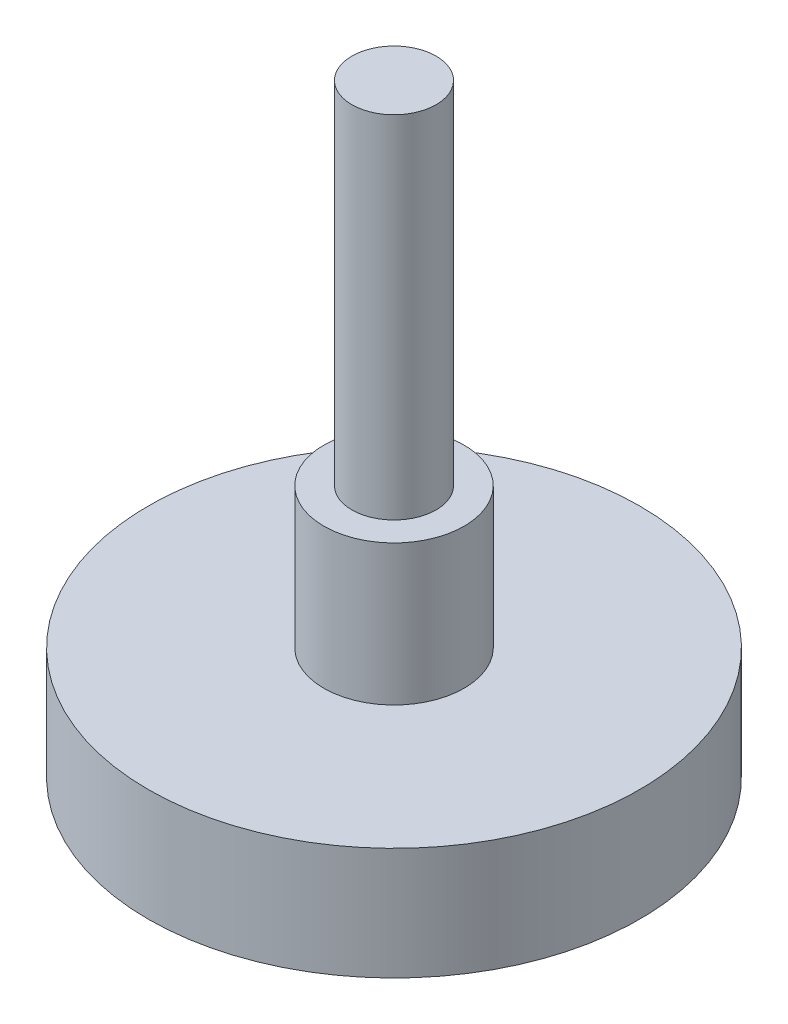
ISO-10303-21;
HEADER;
FILE_DESCRIPTION(('STEP AP214'),'2;1');
FILE_NAME('part.step','',(''),(''),'','','');
FILE_SCHEMA(('AUTOMOTIVE_DESIGN { 1 0 10303 214 1 1 1 1 }'));
ENDSEC;
DATA;
#1=APPLICATION_CONTEXT('core data for automotive mechanical design processes');
#2=APPLICATION_PROTOCOL_DEFINITION('international standard','automotive_design',2000,#1);
#3=PRODUCT_CONTEXT('',#1,'mechanical');
#4=PRODUCT('Part','Part','',(#3));
#5=PRODUCT_RELATED_PRODUCT_CATEGORY('part','',(#4));
#6=PRODUCT_DEFINITION_FORMATION('','',#4);
#7=PRODUCT_DEFINITION_CONTEXT('part definition',#1,'design');
#8=PRODUCT_DEFINITION('design','',#6,#7);
#9=PRODUCT_DEFINITION_SHAPE('','',#8);
#10=(LENGTH_UNIT() NAMED_UNIT(*) SI_UNIT(.MILLI.,.METRE.));
#11=(NAMED_UNIT(*) PLANE_ANGLE_UNIT() SI_UNIT($,.RADIAN.));
#12=(NAMED_UNIT(*) SI_UNIT($,.STERADIAN.) SOLID_ANGLE_UNIT());
#13=UNCERTAINTY_MEASURE_WITH_UNIT(LENGTH_MEASURE(1.E-05),#10,'distance_accuracy_value','');
#14=(GEOMETRIC_REPRESENTATION_CONTEXT(3) GLOBAL_UNCERTAINTY_ASSIGNED_CONTEXT((#13)) GLOBAL_UNIT_ASSIGNED_CONTEXT((#10,
#11,#12)) REPRESENTATION_CONTEXT('',''));
#15=CARTESIAN_POINT('',(0.,0.,0.));
#16=DIRECTION('',(0.,0.,1.));
#17=DIRECTION('',(1.,0.,0.));
#18=AXIS2_PLACEMENT_3D('',#15,#16,#17);
#19=CARTESIAN_POINT('',(0.,8.,0.));
#20=DIRECTION('',(0.,-1.,0.));
#21=DIRECTION('',(0.,0.,-1.));
#22=AXIS2_PLACEMENT_3D('',#19,#20,#21);
#23=CYLINDRICAL_SURFACE('',#22,17.5);
#24=CARTESIAN_POINT('',(0.,8.,0.));
#25=DIRECTION('',(0.,1.,0.));
#26=DIRECTION('',(0.,0.,1.));
#27=AXIS2_PLACEMENT_3D('',#24,#25,#26);
#28=CIRCLE('',#27,17.5);
#29=CARTESIAN_POINT('',(0.,8.,17.5));
#30=VERTEX_POINT('',#29);
#31=EDGE_CURVE('E43',#30,#30,#28,.T.);
#32=ORIENTED_EDGE('',*,*,#31,.F.);
#33=EDGE_LOOP('',(#32));
#34=FACE_BOUND('',#33,.T.);
#35=CARTESIAN_POINT('',(0.,0.,0.));
#36=DIRECTION('',(0.,1.,0.));
#37=DIRECTION('',(0.,0.,1.));
#38=AXIS2_PLACEMENT_3D('',#35,#36,#37);
#39=CIRCLE('',#38,17.5);
#40=CARTESIAN_POINT('',(0.,0.,17.5));
#41=VERTEX_POINT('',#40);
#42=EDGE_CURVE('E34',#41,#41,#39,.T.);
#43=ORIENTED_EDGE('',*,*,#42,.T.);
#44=EDGE_LOOP('',(#43));
#45=FACE_BOUND('',#44,.T.);
#46=ADVANCED_FACE('F31',(#34,#45),#23,.T.);
#47=CARTESIAN_POINT('',(0.,8.,0.));
#48=DIRECTION('',(0.,1.,0.));
#49=DIRECTION('',(0.,0.,1.));
#50=AXIS2_PLACEMENT_3D('',#47,#48,#49);
#51=PLANE('',#50);
#52=CARTESIAN_POINT('',(0.,8.,0.));
#53=DIRECTION('',(0.,1.,0.));
#54=DIRECTION('',(0.,0.,1.));
#55=AXIS2_PLACEMENT_3D('',#52,#53,#54);
#56=CIRCLE('',#55,5.);
#57=CARTESIAN_POINT('',(0.,8.,5.));
#58=VERTEX_POINT('',#57);
#59=EDGE_CURVE('E38',#58,#58,#56,.T.);
#60=ORIENTED_EDGE('',*,*,#59,.F.);
#61=EDGE_LOOP('',(#60));
#62=FACE_BOUND('',#61,.T.);
#63=ORIENTED_EDGE('',*,*,#31,.T.);
#64=EDGE_LOOP('',(#63));
#65=FACE_BOUND('',#64,.T.);
#66=ADVANCED_FACE('F60',(#62,#65),#51,.T.);
#67=CARTESIAN_POINT('',(0.,0.,0.));
#68=DIRECTION('',(0.,1.,0.));
#69=DIRECTION('',(0.,0.,1.));
#70=AXIS2_PLACEMENT_3D('',#67,#68,#69);
#71=PLANE('',#70);
#72=ORIENTED_EDGE('',*,*,#42,.F.);
#73=EDGE_LOOP('',(#72));
#74=FACE_BOUND('',#73,.T.);
#75=ADVANCED_FACE('F57',(#74),#71,.F.);
#76=CARTESIAN_POINT('',(0.,18.,0.));
#77=DIRECTION('',(0.,-1.,0.));
#78=DIRECTION('',(0.,0.,-1.));
#79=AXIS2_PLACEMENT_3D('',#76,#77,#78);
#80=CYLINDRICAL_SURFACE('',#79,5.);
#81=CARTESIAN_POINT('',(0.,18.,0.));
#82=DIRECTION('',(0.,1.,0.));
#83=DIRECTION('',(0.,0.,1.));
#84=AXIS2_PLACEMENT_3D('',#81,#82,#83);
#85=CIRCLE('',#84,5.);
#86=CARTESIAN_POINT('',(0.,18.,5.));
#87=VERTEX_POINT('',#86);
#88=EDGE_CURVE('E48',#87,#87,#85,.T.);
#89=ORIENTED_EDGE('',*,*,#88,.F.);
#90=EDGE_LOOP('',(#89));
#91=FACE_BOUND('',#90,.T.);
#92=ORIENTED_EDGE('',*,*,#59,.T.);
#93=EDGE_LOOP('',(#92));
#94=FACE_BOUND('',#93,.T.);
#95=ADVANCED_FACE('F59',(#91,#94),#80,.T.);
#96=CARTESIAN_POINT('',(0.,18.,0.));
#97=DIRECTION('',(0.,1.,0.));
#98=DIRECTION('',(0.,0.,1.));
#99=AXIS2_PLACEMENT_3D('',#96,#97,#98);
#100=PLANE('',#99);
#101=CARTESIAN_POINT('',(0.,18.,0.));
#102=DIRECTION('',(0.,1.,0.));
#103=DIRECTION('',(0.,0.,1.));
#104=AXIS2_PLACEMENT_3D('',#101,#102,#103);
#105=CIRCLE('',#104,3.);
#106=CARTESIAN_POINT('',(0.,18.,3.));
#107=VERTEX_POINT('',#106);
#108=EDGE_CURVE('E10',#107,#107,#105,.T.);
#109=ORIENTED_EDGE('',*,*,#108,.F.);
#110=EDGE_LOOP('',(#109));
#111=FACE_BOUND('',#110,.T.);
#112=ORIENTED_EDGE('',*,*,#88,.T.);
#113=EDGE_LOOP('',(#112));
#114=FACE_BOUND('',#113,.T.);
#115=ADVANCED_FACE('F65',(#111,#114),#100,.T.);
#116=CARTESIAN_POINT('',(0.,43.,0.));
#117=DIRECTION('',(0.,-1.,0.));
#118=DIRECTION('',(0.,0.,-1.));
#119=AXIS2_PLACEMENT_3D('',#116,#117,#118);
#120=CYLINDRICAL_SURFACE('',#119,3.);
#121=CARTESIAN_POINT('',(0.,43.,0.));
#122=DIRECTION('',(0.,1.,0.));
#123=DIRECTION('',(0.,0.,1.));
#124=AXIS2_PLACEMENT_3D('',#121,#122,#123);
#125=CIRCLE('',#124,3.);
#126=CARTESIAN_POINT('',(0.,43.,3.));
#127=VERTEX_POINT('',#126);
#128=EDGE_CURVE('E47',#127,#127,#125,.T.);
#129=ORIENTED_EDGE('',*,*,#128,.F.);
#130=EDGE_LOOP('',(#129));
#131=FACE_BOUND('',#130,.T.);
#132=ORIENTED_EDGE('',*,*,#108,.T.);
#133=EDGE_LOOP('',(#132));
#134=FACE_BOUND('',#133,.T.);
#135=ADVANCED_FACE('F95',(#131,#134),#120,.T.);
#136=CARTESIAN_POINT('',(0.,43.,0.));
#137=DIRECTION('',(0.,1.,0.));
#138=DIRECTION('',(0.,0.,1.));
#139=AXIS2_PLACEMENT_3D('',#136,#137,#138);
#140=PLANE('',#139);
#141=ORIENTED_EDGE('',*,*,#128,.T.);
#142=EDGE_LOOP('',(#141));
#143=FACE_BOUND('',#142,.T.);
#144=ADVANCED_FACE('F105',(#143),#140,.T.);
#145=CLOSED_SHELL('',(#46,#66,#75,#95,#115,#135,#144));
#146=MANIFOLD_SOLID_BREP('B2',#145);
#147=ADVANCED_BREP_SHAPE_REPRESENTATION('',(#18,#146),#14);
#148=SHAPE_DEFINITION_REPRESENTATION(#9,#147);
ENDSEC;
END-ISO-10303-21;
